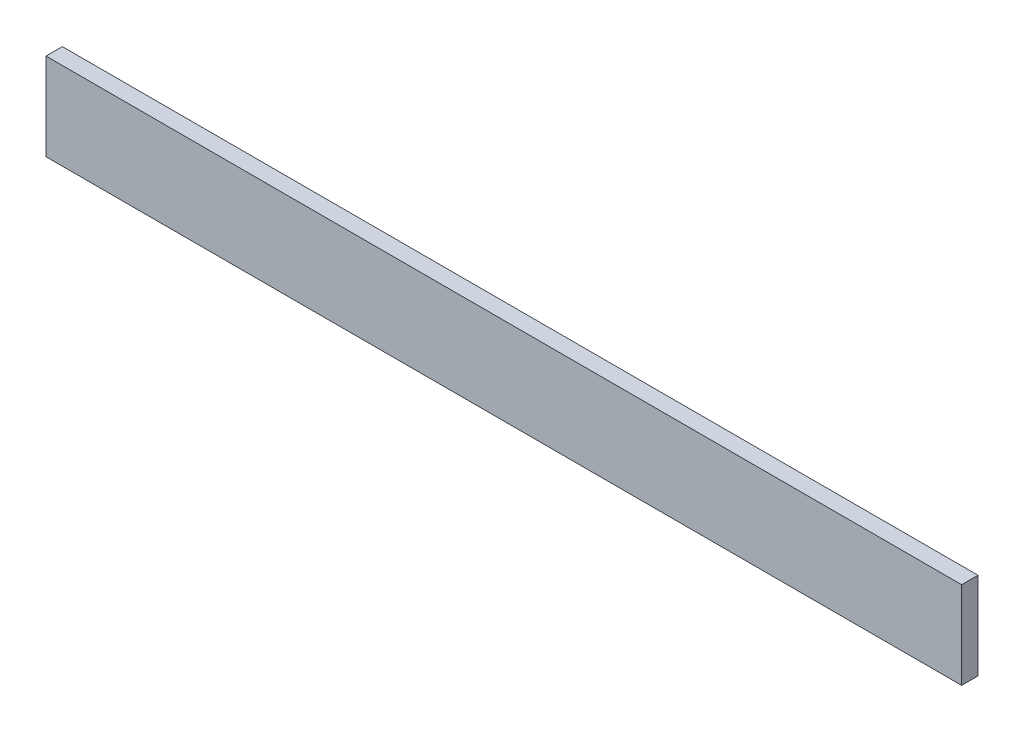
ISO-10303-21;
HEADER;
FILE_DESCRIPTION(('STEP AP214'),'2;1');
FILE_NAME('part.step','',(''),(''),'','','');
FILE_SCHEMA(('AUTOMOTIVE_DESIGN { 1 0 10303 214 1 1 1 1 }'));
ENDSEC;
DATA;
#1=APPLICATION_CONTEXT('core data for automotive mechanical design processes');
#2=APPLICATION_PROTOCOL_DEFINITION('international standard','automotive_design',2000,#1);
#3=PRODUCT_CONTEXT('',#1,'mechanical');
#4=PRODUCT('Part','Part','',(#3));
#5=PRODUCT_RELATED_PRODUCT_CATEGORY('part','',(#4));
#6=PRODUCT_DEFINITION_FORMATION('','',#4);
#7=PRODUCT_DEFINITION_CONTEXT('part definition',#1,'design');
#8=PRODUCT_DEFINITION('design','',#6,#7);
#9=PRODUCT_DEFINITION_SHAPE('','',#8);
#10=(LENGTH_UNIT() NAMED_UNIT(*) SI_UNIT(.MILLI.,.METRE.));
#11=(NAMED_UNIT(*) PLANE_ANGLE_UNIT() SI_UNIT($,.RADIAN.));
#12=(NAMED_UNIT(*) SI_UNIT($,.STERADIAN.) SOLID_ANGLE_UNIT());
#13=UNCERTAINTY_MEASURE_WITH_UNIT(LENGTH_MEASURE(1.E-05),#10,'distance_accuracy_value','');
#14=(GEOMETRIC_REPRESENTATION_CONTEXT(3) GLOBAL_UNCERTAINTY_ASSIGNED_CONTEXT((#13)) GLOBAL_UNIT_ASSIGNED_CONTEXT((#10,
#11,#12)) REPRESENTATION_CONTEXT('',''));
#15=CARTESIAN_POINT('',(0.,0.,0.));
#16=DIRECTION('',(0.,0.,1.));
#17=DIRECTION('',(1.,0.,0.));
#18=AXIS2_PLACEMENT_3D('',#15,#16,#17);
#19=CARTESIAN_POINT('',(533.4,-50.8,19.05));
#20=DIRECTION('',(-1.,0.,0.));
#21=DIRECTION('',(0.,0.,1.));
#22=AXIS2_PLACEMENT_3D('',#19,#20,#21);
#23=PLANE('',#22);
#24=DIRECTION('',(0.,1.,0.));
#25=VECTOR('',#24,1.);
#26=CARTESIAN_POINT('',(533.4,-50.8,0.));
#27=LINE('',#26,#25);
#28=CARTESIAN_POINT('',(533.4,-50.8,0.));
#29=VERTEX_POINT('',#28);
#30=CARTESIAN_POINT('',(533.4,50.8,0.));
#31=VERTEX_POINT('',#30);
#32=EDGE_CURVE('E107',#29,#31,#27,.T.);
#33=ORIENTED_EDGE('',*,*,#32,.T.);
#34=DIRECTION('',(0.,0.,-1.));
#35=VECTOR('',#34,1.);
#36=CARTESIAN_POINT('',(533.4,50.8,19.05));
#37=LINE('',#36,#35);
#38=CARTESIAN_POINT('',(533.4,50.8,19.05));
#39=VERTEX_POINT('',#38);
#40=EDGE_CURVE('E11',#39,#31,#37,.T.);
#41=ORIENTED_EDGE('',*,*,#40,.F.);
#42=DIRECTION('',(0.,1.,0.));
#43=VECTOR('',#42,1.);
#44=CARTESIAN_POINT('',(533.4,-50.8,19.05));
#45=LINE('',#44,#43);
#46=CARTESIAN_POINT('',(533.4,-50.8,19.05));
#47=VERTEX_POINT('',#46);
#48=EDGE_CURVE('E91',#47,#39,#45,.T.);
#49=ORIENTED_EDGE('',*,*,#48,.F.);
#50=DIRECTION('',(0.,0.,-1.));
#51=VECTOR('',#50,1.);
#52=CARTESIAN_POINT('',(533.4,-50.8,19.05));
#53=LINE('',#52,#51);
#54=EDGE_CURVE('E103',#47,#29,#53,.T.);
#55=ORIENTED_EDGE('',*,*,#54,.T.);
#56=EDGE_LOOP('',(#33,#41,#49,#55));
#57=FACE_BOUND('',#56,.T.);
#58=ADVANCED_FACE('F39',(#57),#23,.F.);
#59=CARTESIAN_POINT('',(-533.4,50.8,19.05));
#60=DIRECTION('',(0.,-1.,0.));
#61=DIRECTION('',(0.,0.,-1.));
#62=AXIS2_PLACEMENT_3D('',#59,#60,#61);
#63=PLANE('',#62);
#64=DIRECTION('',(-1.,0.,0.));
#65=VECTOR('',#64,1.);
#66=CARTESIAN_POINT('',(-533.4,50.8,0.));
#67=LINE('',#66,#65);
#68=CARTESIAN_POINT('',(-533.4,50.8,0.));
#69=VERTEX_POINT('',#68);
#70=EDGE_CURVE('E96',#31,#69,#67,.T.);
#71=ORIENTED_EDGE('',*,*,#70,.T.);
#72=DIRECTION('',(0.,0.,-1.));
#73=VECTOR('',#72,1.);
#74=CARTESIAN_POINT('',(-533.4,50.8,19.05));
#75=LINE('',#74,#73);
#76=CARTESIAN_POINT('',(-533.4,50.8,19.05));
#77=VERTEX_POINT('',#76);
#78=EDGE_CURVE('E48',#77,#69,#75,.T.);
#79=ORIENTED_EDGE('',*,*,#78,.F.);
#80=DIRECTION('',(-1.,0.,0.));
#81=VECTOR('',#80,1.);
#82=CARTESIAN_POINT('',(-533.4,50.8,19.05));
#83=LINE('',#82,#81);
#84=EDGE_CURVE('E86',#39,#77,#83,.T.);
#85=ORIENTED_EDGE('',*,*,#84,.F.);
#86=ORIENTED_EDGE('',*,*,#40,.T.);
#87=EDGE_LOOP('',(#71,#79,#85,#86));
#88=FACE_BOUND('',#87,.T.);
#89=ADVANCED_FACE('F95',(#88),#63,.F.);
#90=CARTESIAN_POINT('',(-533.4,-50.8,19.05));
#91=DIRECTION('',(1.,0.,0.));
#92=DIRECTION('',(0.,0.,-1.));
#93=AXIS2_PLACEMENT_3D('',#90,#91,#92);
#94=PLANE('',#93);
#95=DIRECTION('',(0.,-1.,0.));
#96=VECTOR('',#95,1.);
#97=CARTESIAN_POINT('',(-533.4,-50.8,0.));
#98=LINE('',#97,#96);
#99=CARTESIAN_POINT('',(-533.4,-50.8,0.));
#100=VERTEX_POINT('',#99);
#101=EDGE_CURVE('E73',#69,#100,#98,.T.);
#102=ORIENTED_EDGE('',*,*,#101,.T.);
#103=DIRECTION('',(0.,0.,-1.));
#104=VECTOR('',#103,1.);
#105=CARTESIAN_POINT('',(-533.4,-50.8,19.05));
#106=LINE('',#105,#104);
#107=CARTESIAN_POINT('',(-533.4,-50.8,19.05));
#108=VERTEX_POINT('',#107);
#109=EDGE_CURVE('E98',#108,#100,#106,.T.);
#110=ORIENTED_EDGE('',*,*,#109,.F.);
#111=DIRECTION('',(0.,-1.,0.));
#112=VECTOR('',#111,1.);
#113=CARTESIAN_POINT('',(-533.4,-50.8,19.05));
#114=LINE('',#113,#112);
#115=EDGE_CURVE('E89',#77,#108,#114,.T.);
#116=ORIENTED_EDGE('',*,*,#115,.F.);
#117=ORIENTED_EDGE('',*,*,#78,.T.);
#118=EDGE_LOOP('',(#102,#110,#116,#117));
#119=FACE_BOUND('',#118,.T.);
#120=ADVANCED_FACE('F99',(#119),#94,.F.);
#121=CARTESIAN_POINT('',(-533.4,-50.8,19.05));
#122=DIRECTION('',(0.,1.,0.));
#123=DIRECTION('',(0.,0.,1.));
#124=AXIS2_PLACEMENT_3D('',#121,#122,#123);
#125=PLANE('',#124);
#126=DIRECTION('',(1.,0.,0.));
#127=VECTOR('',#126,1.);
#128=CARTESIAN_POINT('',(-533.4,-50.8,0.));
#129=LINE('',#128,#127);
#130=EDGE_CURVE('E79',#100,#29,#129,.T.);
#131=ORIENTED_EDGE('',*,*,#130,.T.);
#132=ORIENTED_EDGE('',*,*,#54,.F.);
#133=DIRECTION('',(1.,0.,0.));
#134=VECTOR('',#133,1.);
#135=CARTESIAN_POINT('',(-533.4,-50.8,19.05));
#136=LINE('',#135,#134);
#137=EDGE_CURVE('E56',#108,#47,#136,.T.);
#138=ORIENTED_EDGE('',*,*,#137,.F.);
#139=ORIENTED_EDGE('',*,*,#109,.T.);
#140=EDGE_LOOP('',(#131,#132,#138,#139));
#141=FACE_BOUND('',#140,.T.);
#142=ADVANCED_FACE('F120',(#141),#125,.F.);
#143=CARTESIAN_POINT('',(0.,0.,19.05));
#144=DIRECTION('',(0.,0.,-1.));
#145=DIRECTION('',(-1.,0.,0.));
#146=AXIS2_PLACEMENT_3D('',#143,#144,#145);
#147=PLANE('',#146);
#148=ORIENTED_EDGE('',*,*,#48,.T.);
#149=ORIENTED_EDGE('',*,*,#84,.T.);
#150=ORIENTED_EDGE('',*,*,#115,.T.);
#151=ORIENTED_EDGE('',*,*,#137,.T.);
#152=EDGE_LOOP('',(#148,#149,#150,#151));
#153=FACE_BOUND('',#152,.T.);
#154=ADVANCED_FACE('F87',(#153),#147,.F.);
#155=CARTESIAN_POINT('',(0.,0.,0.));
#156=DIRECTION('',(0.,0.,-1.));
#157=DIRECTION('',(-1.,0.,0.));
#158=AXIS2_PLACEMENT_3D('',#155,#156,#157);
#159=PLANE('',#158);
#160=ORIENTED_EDGE('',*,*,#32,.F.);
#161=ORIENTED_EDGE('',*,*,#130,.F.);
#162=ORIENTED_EDGE('',*,*,#101,.F.);
#163=ORIENTED_EDGE('',*,*,#70,.F.);
#164=EDGE_LOOP('',(#160,#161,#162,#163));
#165=FACE_BOUND('',#164,.T.);
#166=ADVANCED_FACE('F123',(#165),#159,.T.);
#167=CLOSED_SHELL('',(#58,#89,#120,#142,#154,#166));
#168=MANIFOLD_SOLID_BREP('B2',#167);
#169=ADVANCED_BREP_SHAPE_REPRESENTATION('',(#18,#168),#14);
#170=SHAPE_DEFINITION_REPRESENTATION(#9,#169);
ENDSEC;
END-ISO-10303-21;
